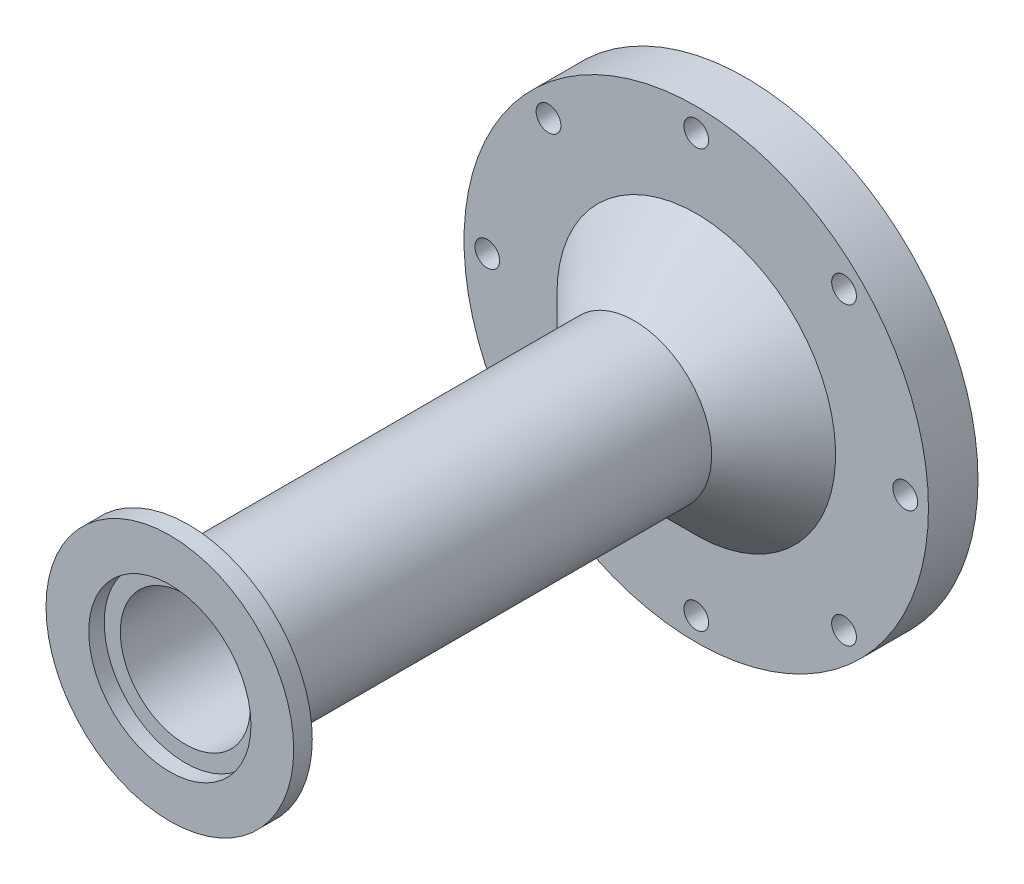
ISO-10303-21;
HEADER;
FILE_DESCRIPTION(('STEP AP214'),'2;1');
FILE_NAME('part.step','',(''),(''),'','','');
FILE_SCHEMA(('AUTOMOTIVE_DESIGN { 1 0 10303 214 1 1 1 1 }'));
ENDSEC;
DATA;
#1=APPLICATION_CONTEXT('core data for automotive mechanical design processes');
#2=APPLICATION_PROTOCOL_DEFINITION('international standard','automotive_design',2000,#1);
#3=PRODUCT_CONTEXT('',#1,'mechanical');
#4=PRODUCT('Part','Part','',(#3));
#5=PRODUCT_RELATED_PRODUCT_CATEGORY('part','',(#4));
#6=PRODUCT_DEFINITION_FORMATION('','',#4);
#7=PRODUCT_DEFINITION_CONTEXT('part definition',#1,'design');
#8=PRODUCT_DEFINITION('design','',#6,#7);
#9=PRODUCT_DEFINITION_SHAPE('','',#8);
#10=(LENGTH_UNIT() NAMED_UNIT(*) SI_UNIT(.MILLI.,.METRE.));
#11=(NAMED_UNIT(*) PLANE_ANGLE_UNIT() SI_UNIT($,.RADIAN.));
#12=(NAMED_UNIT(*) SI_UNIT($,.STERADIAN.) SOLID_ANGLE_UNIT());
#13=UNCERTAINTY_MEASURE_WITH_UNIT(LENGTH_MEASURE(1.E-05),#10,'distance_accuracy_value','');
#14=(GEOMETRIC_REPRESENTATION_CONTEXT(3) GLOBAL_UNCERTAINTY_ASSIGNED_CONTEXT((#13)) GLOBAL_UNIT_ASSIGNED_CONTEXT((#10,
#11,#12)) REPRESENTATION_CONTEXT('',''));
#15=CARTESIAN_POINT('',(0.,0.,0.));
#16=DIRECTION('',(0.,0.,1.));
#17=DIRECTION('',(1.,0.,0.));
#18=AXIS2_PLACEMENT_3D('',#15,#16,#17);
#19=CARTESIAN_POINT('',(0.,0.,88.));
#20=DIRECTION('',(0.,0.,-1.));
#21=DIRECTION('',(-1.,0.,0.));
#22=AXIS2_PLACEMENT_3D('',#19,#20,#21);
#23=CYLINDRICAL_SURFACE('',#22,10.5);
#24=CARTESIAN_POINT('',(0.,0.,0.));
#25=DIRECTION('',(0.,0.,1.));
#26=DIRECTION('',(1.,0.,0.));
#27=AXIS2_PLACEMENT_3D('',#24,#25,#26);
#28=CIRCLE('',#27,10.5);
#29=CARTESIAN_POINT('',(10.5,0.,0.));
#30=VERTEX_POINT('',#29);
#31=EDGE_CURVE('E124',#30,#30,#28,.T.);
#32=ORIENTED_EDGE('',*,*,#31,.F.);
#33=EDGE_LOOP('',(#32));
#34=FACE_BOUND('',#33,.T.);
#35=CARTESIAN_POINT('',(0.,0.,90.51));
#36=DIRECTION('',(0.,0.,1.));
#37=DIRECTION('',(1.,0.,0.));
#38=AXIS2_PLACEMENT_3D('',#35,#36,#37);
#39=CIRCLE('',#38,10.5);
#40=CARTESIAN_POINT('',(10.5,0.,90.51));
#41=VERTEX_POINT('',#40);
#42=EDGE_CURVE('E51',#41,#41,#39,.T.);
#43=ORIENTED_EDGE('',*,*,#42,.T.);
#44=EDGE_LOOP('',(#43));
#45=FACE_BOUND('',#44,.T.);
#46=ADVANCED_FACE('F33',(#34,#45),#23,.F.);
#47=CARTESIAN_POINT('',(0.,0.,8.));
#48=DIRECTION('',(0.,0.,1.));
#49=DIRECTION('',(1.,0.,0.));
#50=AXIS2_PLACEMENT_3D('',#47,#48,#49);
#51=PLANE('',#50);
#52=CARTESIAN_POINT('',(0.,0.,8.));
#53=DIRECTION('',(0.,0.,1.));
#54=DIRECTION('',(1.,0.,0.));
#55=AXIS2_PLACEMENT_3D('',#52,#53,#54);
#56=CIRCLE('',#55,22.4999999999999);
#57=CARTESIAN_POINT('',(-22.4999999999999,0.,8.));
#58=VERTEX_POINT('',#57);
#59=EDGE_CURVE('E10',#58,#58,#56,.F.);
#60=ORIENTED_EDGE('',*,*,#59,.T.);
#61=EDGE_LOOP('',(#60));
#62=FACE_BOUND('',#61,.T.);
#63=CARTESIAN_POINT('',(33.75,0.,8.));
#64=DIRECTION('',(0.,0.,1.));
#65=DIRECTION('',(1.,0.,0.));
#66=AXIS2_PLACEMENT_3D('',#63,#64,#65);
#67=CIRCLE('',#66,2.);
#68=CARTESIAN_POINT('',(35.75,0.,8.));
#69=VERTEX_POINT('',#68);
#70=EDGE_CURVE('E92',#69,#69,#67,.T.);
#71=ORIENTED_EDGE('',*,*,#70,.F.);
#72=EDGE_LOOP('',(#71));
#73=FACE_BOUND('',#72,.T.);
#74=CARTESIAN_POINT('',(-7.23379689482329E-13,-33.7500000000001,8.));
#75=DIRECTION('',(0.,0.,1.));
#76=DIRECTION('',(1.,0.,0.));
#77=AXIS2_PLACEMENT_3D('',#74,#75,#76);
#78=CIRCLE('',#77,2.00000000000001);
#79=CARTESIAN_POINT('',(1.99999999999928,-33.7500000000001,8.));
#80=VERTEX_POINT('',#79);
#81=EDGE_CURVE('E80',#80,#80,#78,.T.);
#82=ORIENTED_EDGE('',*,*,#81,.F.);
#83=EDGE_LOOP('',(#82));
#84=FACE_BOUND('',#83,.T.);
#85=CARTESIAN_POINT('',(-33.7500000000002,1.85615411929518E-13,8.));
#86=DIRECTION('',(0.,0.,1.));
#87=DIRECTION('',(1.,0.,0.));
#88=AXIS2_PLACEMENT_3D('',#85,#86,#87);
#89=CIRCLE('',#88,2.00000000000001);
#90=CARTESIAN_POINT('',(-31.7500000000002,1.85615411929518E-13,8.));
#91=VERTEX_POINT('',#90);
#92=EDGE_CURVE('E68',#91,#91,#89,.T.);
#93=ORIENTED_EDGE('',*,*,#92,.F.);
#94=EDGE_LOOP('',(#93));
#95=FACE_BOUND('',#94,.T.);
#96=CARTESIAN_POINT('',(3.48471251854221E-13,33.75,8.));
#97=DIRECTION('',(0.,0.,1.));
#98=DIRECTION('',(1.,0.,0.));
#99=AXIS2_PLACEMENT_3D('',#96,#97,#98);
#100=CIRCLE('',#99,2.);
#101=CARTESIAN_POINT('',(2.00000000000035,33.75,8.));
#102=VERTEX_POINT('',#101);
#103=EDGE_CURVE('E57',#102,#102,#100,.T.);
#104=ORIENTED_EDGE('',*,*,#103,.F.);
#105=EDGE_LOOP('',(#104));
#106=FACE_BOUND('',#105,.T.);
#107=CARTESIAN_POINT('',(0.,0.,8.));
#108=DIRECTION('',(0.,0.,1.));
#109=DIRECTION('',(1.,0.,0.));
#110=AXIS2_PLACEMENT_3D('',#107,#108,#109);
#111=CIRCLE('',#110,37.5);
#112=CARTESIAN_POINT('',(37.5,0.,8.));
#113=VERTEX_POINT('',#112);
#114=EDGE_CURVE('E44',#113,#113,#111,.T.);
#115=ORIENTED_EDGE('',*,*,#114,.T.);
#116=EDGE_LOOP('',(#115));
#117=FACE_BOUND('',#116,.T.);
#118=CARTESIAN_POINT('',(-23.8648538650459,23.8648538650462,8.));
#119=DIRECTION('',(0.,0.,1.));
#120=DIRECTION('',(1.,0.,0.));
#121=AXIS2_PLACEMENT_3D('',#118,#119,#120);
#122=CIRCLE('',#121,2.00000000000001);
#123=CARTESIAN_POINT('',(-21.8648538650459,23.8648538650462,8.));
#124=VERTEX_POINT('',#123);
#125=EDGE_CURVE('E62',#124,#124,#122,.T.);
#126=ORIENTED_EDGE('',*,*,#125,.F.);
#127=EDGE_LOOP('',(#126));
#128=FACE_BOUND('',#127,.T.);
#129=CARTESIAN_POINT('',(-23.8648538650466,-23.8648538650456,8.));
#130=DIRECTION('',(0.,0.,1.));
#131=DIRECTION('',(1.,0.,0.));
#132=AXIS2_PLACEMENT_3D('',#129,#130,#131);
#133=CIRCLE('',#132,2.00000000000001);
#134=CARTESIAN_POINT('',(-21.8648538650466,-23.8648538650456,8.));
#135=VERTEX_POINT('',#134);
#136=EDGE_CURVE('E74',#135,#135,#133,.T.);
#137=ORIENTED_EDGE('',*,*,#136,.F.);
#138=EDGE_LOOP('',(#137));
#139=FACE_BOUND('',#138,.T.);
#140=CARTESIAN_POINT('',(23.8648538650455,-23.8648538650465,8.));
#141=DIRECTION('',(0.,0.,1.));
#142=DIRECTION('',(1.,0.,0.));
#143=AXIS2_PLACEMENT_3D('',#140,#141,#142);
#144=CIRCLE('',#143,2.);
#145=CARTESIAN_POINT('',(25.8648538650455,-23.8648538650465,8.));
#146=VERTEX_POINT('',#145);
#147=EDGE_CURVE('E86',#146,#146,#144,.T.);
#148=ORIENTED_EDGE('',*,*,#147,.F.);
#149=EDGE_LOOP('',(#148));
#150=FACE_BOUND('',#149,.T.);
#151=CARTESIAN_POINT('',(23.8648538650463,23.8648538650457,8.));
#152=DIRECTION('',(0.,0.,1.));
#153=DIRECTION('',(1.,0.,0.));
#154=AXIS2_PLACEMENT_3D('',#151,#152,#153);
#155=CIRCLE('',#154,2.);
#156=CARTESIAN_POINT('',(25.8648538650463,23.8648538650457,8.));
#157=VERTEX_POINT('',#156);
#158=EDGE_CURVE('E98',#157,#157,#155,.T.);
#159=ORIENTED_EDGE('',*,*,#158,.F.);
#160=EDGE_LOOP('',(#159));
#161=FACE_BOUND('',#160,.T.);
#162=ADVANCED_FACE('F173',(#62,#73,#84,#95,#106,#117,#128,#139,#150,#161),#51,.T.);
#163=CARTESIAN_POINT('',(0.,0.,0.));
#164=DIRECTION('',(0.,0.,1.));
#165=DIRECTION('',(1.,0.,0.));
#166=AXIS2_PLACEMENT_3D('',#163,#164,#165);
#167=PLANE('',#166);
#168=CARTESIAN_POINT('',(33.75,0.,0.));
#169=DIRECTION('',(0.,0.,1.));
#170=DIRECTION('',(1.,0.,0.));
#171=AXIS2_PLACEMENT_3D('',#168,#169,#170);
#172=CIRCLE('',#171,2.);
#173=CARTESIAN_POINT('',(35.75,0.,0.));
#174=VERTEX_POINT('',#173);
#175=EDGE_CURVE('E95',#174,#174,#172,.T.);
#176=ORIENTED_EDGE('',*,*,#175,.T.);
#177=EDGE_LOOP('',(#176));
#178=FACE_BOUND('',#177,.T.);
#179=CARTESIAN_POINT('',(-7.23379689482329E-13,-33.7500000000001,0.));
#180=DIRECTION('',(0.,0.,1.));
#181=DIRECTION('',(1.,0.,0.));
#182=AXIS2_PLACEMENT_3D('',#179,#180,#181);
#183=CIRCLE('',#182,2.00000000000001);
#184=CARTESIAN_POINT('',(1.99999999999928,-33.7500000000001,0.));
#185=VERTEX_POINT('',#184);
#186=EDGE_CURVE('E83',#185,#185,#183,.T.);
#187=ORIENTED_EDGE('',*,*,#186,.T.);
#188=EDGE_LOOP('',(#187));
#189=FACE_BOUND('',#188,.T.);
#190=CARTESIAN_POINT('',(-33.7500000000002,1.85615411929518E-13,0.));
#191=DIRECTION('',(0.,0.,1.));
#192=DIRECTION('',(1.,0.,0.));
#193=AXIS2_PLACEMENT_3D('',#190,#191,#192);
#194=CIRCLE('',#193,2.00000000000001);
#195=CARTESIAN_POINT('',(-31.7500000000002,1.85615411929518E-13,0.));
#196=VERTEX_POINT('',#195);
#197=EDGE_CURVE('E71',#196,#196,#194,.T.);
#198=ORIENTED_EDGE('',*,*,#197,.T.);
#199=EDGE_LOOP('',(#198));
#200=FACE_BOUND('',#199,.T.);
#201=CARTESIAN_POINT('',(3.48471251854221E-13,33.75,0.));
#202=DIRECTION('',(0.,0.,1.));
#203=DIRECTION('',(1.,0.,0.));
#204=AXIS2_PLACEMENT_3D('',#201,#202,#203);
#205=CIRCLE('',#204,2.);
#206=CARTESIAN_POINT('',(2.00000000000035,33.75,0.));
#207=VERTEX_POINT('',#206);
#208=EDGE_CURVE('E59',#207,#207,#205,.T.);
#209=ORIENTED_EDGE('',*,*,#208,.T.);
#210=EDGE_LOOP('',(#209));
#211=FACE_BOUND('',#210,.T.);
#212=CARTESIAN_POINT('',(0.,0.,0.));
#213=DIRECTION('',(0.,0.,1.));
#214=DIRECTION('',(1.,0.,0.));
#215=AXIS2_PLACEMENT_3D('',#212,#213,#214);
#216=CIRCLE('',#215,37.5);
#217=CARTESIAN_POINT('',(37.5,0.,0.));
#218=VERTEX_POINT('',#217);
#219=EDGE_CURVE('E48',#218,#218,#216,.T.);
#220=ORIENTED_EDGE('',*,*,#219,.F.);
#221=EDGE_LOOP('',(#220));
#222=FACE_BOUND('',#221,.T.);
#223=CARTESIAN_POINT('',(-23.8648538650459,23.8648538650462,0.));
#224=DIRECTION('',(0.,0.,1.));
#225=DIRECTION('',(1.,0.,0.));
#226=AXIS2_PLACEMENT_3D('',#223,#224,#225);
#227=CIRCLE('',#226,2.00000000000001);
#228=CARTESIAN_POINT('',(-21.8648538650459,23.8648538650462,0.));
#229=VERTEX_POINT('',#228);
#230=EDGE_CURVE('E65',#229,#229,#227,.T.);
#231=ORIENTED_EDGE('',*,*,#230,.T.);
#232=EDGE_LOOP('',(#231));
#233=FACE_BOUND('',#232,.T.);
#234=CARTESIAN_POINT('',(-23.8648538650466,-23.8648538650456,0.));
#235=DIRECTION('',(0.,0.,1.));
#236=DIRECTION('',(1.,0.,0.));
#237=AXIS2_PLACEMENT_3D('',#234,#235,#236);
#238=CIRCLE('',#237,2.00000000000001);
#239=CARTESIAN_POINT('',(-21.8648538650466,-23.8648538650456,0.));
#240=VERTEX_POINT('',#239);
#241=EDGE_CURVE('E77',#240,#240,#238,.T.);
#242=ORIENTED_EDGE('',*,*,#241,.T.);
#243=EDGE_LOOP('',(#242));
#244=FACE_BOUND('',#243,.T.);
#245=CARTESIAN_POINT('',(23.8648538650455,-23.8648538650465,0.));
#246=DIRECTION('',(0.,0.,1.));
#247=DIRECTION('',(1.,0.,0.));
#248=AXIS2_PLACEMENT_3D('',#245,#246,#247);
#249=CIRCLE('',#248,2.);
#250=CARTESIAN_POINT('',(25.8648538650455,-23.8648538650465,0.));
#251=VERTEX_POINT('',#250);
#252=EDGE_CURVE('E89',#251,#251,#249,.T.);
#253=ORIENTED_EDGE('',*,*,#252,.T.);
#254=EDGE_LOOP('',(#253));
#255=FACE_BOUND('',#254,.T.);
#256=CARTESIAN_POINT('',(23.8648538650463,23.8648538650457,0.));
#257=DIRECTION('',(0.,0.,1.));
#258=DIRECTION('',(1.,0.,0.));
#259=AXIS2_PLACEMENT_3D('',#256,#257,#258);
#260=CIRCLE('',#259,2.);
#261=CARTESIAN_POINT('',(25.8648538650463,23.8648538650457,0.));
#262=VERTEX_POINT('',#261);
#263=EDGE_CURVE('E101',#262,#262,#260,.T.);
#264=ORIENTED_EDGE('',*,*,#263,.T.);
#265=EDGE_LOOP('',(#264));
#266=FACE_BOUND('',#265,.T.);
#267=CARTESIAN_POINT('',(0.,0.,0.));
#268=DIRECTION('',(0.,0.,1.));
#269=DIRECTION('',(1.,0.,0.));
#270=AXIS2_PLACEMENT_3D('',#267,#268,#269);
#271=CIRCLE('',#270,20.71);
#272=CARTESIAN_POINT('',(20.71,0.,0.));
#273=VERTEX_POINT('',#272);
#274=EDGE_CURVE('E107',#273,#273,#271,.T.);
#275=ORIENTED_EDGE('',*,*,#274,.T.);
#276=EDGE_LOOP('',(#275));
#277=FACE_BOUND('',#276,.T.);
#278=ADVANCED_FACE('F178',(#178,#189,#200,#211,#222,#233,#244,#255,#266,#277),#167,.F.);
#279=ORIENTED_EDGE('',*,*,#31,.T.);
#280=EDGE_LOOP('',(#279));
#281=FACE_BOUND('',#280,.T.);
#282=CARTESIAN_POINT('',(0.,0.,0.));
#283=DIRECTION('',(0.,0.,1.));
#284=DIRECTION('',(1.,0.,0.));
#285=AXIS2_PLACEMENT_3D('',#282,#283,#284);
#286=CIRCLE('',#285,19.21);
#287=CARTESIAN_POINT('',(19.21,0.,0.));
#288=VERTEX_POINT('',#287);
#289=EDGE_CURVE('E113',#288,#288,#286,.T.);
#290=ORIENTED_EDGE('',*,*,#289,.F.);
#291=EDGE_LOOP('',(#290));
#292=FACE_BOUND('',#291,.T.);
#293=ADVANCED_FACE('F239',(#281,#292),#167,.F.);
#294=CARTESIAN_POINT('',(0.,0.,8.));
#295=DIRECTION('',(0.,0.,-1.));
#296=DIRECTION('',(-1.,0.,0.));
#297=AXIS2_PLACEMENT_3D('',#294,#295,#296);
#298=CYLINDRICAL_SURFACE('',#297,37.5);
#299=ORIENTED_EDGE('',*,*,#114,.F.);
#300=EDGE_LOOP('',(#299));
#301=FACE_BOUND('',#300,.T.);
#302=ORIENTED_EDGE('',*,*,#219,.T.);
#303=EDGE_LOOP('',(#302));
#304=FACE_BOUND('',#303,.T.);
#305=ADVANCED_FACE('F244',(#301,#304),#298,.T.);
#306=CARTESIAN_POINT('',(3.48471251854221E-13,33.75,8.));
#307=DIRECTION('',(0.,0.,-1.));
#308=DIRECTION('',(-1.,0.,0.));
#309=AXIS2_PLACEMENT_3D('',#306,#307,#308);
#310=CYLINDRICAL_SURFACE('',#309,2.);
#311=ORIENTED_EDGE('',*,*,#103,.T.);
#312=EDGE_LOOP('',(#311));
#313=FACE_BOUND('',#312,.T.);
#314=ORIENTED_EDGE('',*,*,#208,.F.);
#315=EDGE_LOOP('',(#314));
#316=FACE_BOUND('',#315,.T.);
#317=ADVANCED_FACE('F354',(#313,#316),#310,.F.);
#318=CARTESIAN_POINT('',(-23.8648538650459,23.8648538650462,8.));
#319=DIRECTION('',(0.,0.,-1.));
#320=DIRECTION('',(-1.,0.,0.));
#321=AXIS2_PLACEMENT_3D('',#318,#319,#320);
#322=CYLINDRICAL_SURFACE('',#321,2.00000000000001);
#323=ORIENTED_EDGE('',*,*,#125,.T.);
#324=EDGE_LOOP('',(#323));
#325=FACE_BOUND('',#324,.T.);
#326=ORIENTED_EDGE('',*,*,#230,.F.);
#327=EDGE_LOOP('',(#326));
#328=FACE_BOUND('',#327,.T.);
#329=ADVANCED_FACE('F344',(#325,#328),#322,.F.);
#330=CARTESIAN_POINT('',(-33.7500000000002,1.85615411929518E-13,8.));
#331=DIRECTION('',(0.,0.,-1.));
#332=DIRECTION('',(-1.,0.,0.));
#333=AXIS2_PLACEMENT_3D('',#330,#331,#332);
#334=CYLINDRICAL_SURFACE('',#333,2.00000000000001);
#335=ORIENTED_EDGE('',*,*,#92,.T.);
#336=EDGE_LOOP('',(#335));
#337=FACE_BOUND('',#336,.T.);
#338=ORIENTED_EDGE('',*,*,#197,.F.);
#339=EDGE_LOOP('',(#338));
#340=FACE_BOUND('',#339,.T.);
#341=ADVANCED_FACE('F334',(#337,#340),#334,.F.);
#342=CARTESIAN_POINT('',(-23.8648538650466,-23.8648538650456,8.));
#343=DIRECTION('',(0.,0.,-1.));
#344=DIRECTION('',(-1.,0.,0.));
#345=AXIS2_PLACEMENT_3D('',#342,#343,#344);
#346=CYLINDRICAL_SURFACE('',#345,2.00000000000001);
#347=ORIENTED_EDGE('',*,*,#136,.T.);
#348=EDGE_LOOP('',(#347));
#349=FACE_BOUND('',#348,.T.);
#350=ORIENTED_EDGE('',*,*,#241,.F.);
#351=EDGE_LOOP('',(#350));
#352=FACE_BOUND('',#351,.T.);
#353=ADVANCED_FACE('F324',(#349,#352),#346,.F.);
#354=CARTESIAN_POINT('',(-7.23379689482329E-13,-33.7500000000001,8.));
#355=DIRECTION('',(0.,0.,-1.));
#356=DIRECTION('',(-1.,0.,0.));
#357=AXIS2_PLACEMENT_3D('',#354,#355,#356);
#358=CYLINDRICAL_SURFACE('',#357,2.00000000000001);
#359=ORIENTED_EDGE('',*,*,#81,.T.);
#360=EDGE_LOOP('',(#359));
#361=FACE_BOUND('',#360,.T.);
#362=ORIENTED_EDGE('',*,*,#186,.F.);
#363=EDGE_LOOP('',(#362));
#364=FACE_BOUND('',#363,.T.);
#365=ADVANCED_FACE('F314',(#361,#364),#358,.F.);
#366=CARTESIAN_POINT('',(23.8648538650455,-23.8648538650465,8.));
#367=DIRECTION('',(0.,0.,-1.));
#368=DIRECTION('',(-1.,0.,0.));
#369=AXIS2_PLACEMENT_3D('',#366,#367,#368);
#370=CYLINDRICAL_SURFACE('',#369,2.);
#371=ORIENTED_EDGE('',*,*,#147,.T.);
#372=EDGE_LOOP('',(#371));
#373=FACE_BOUND('',#372,.T.);
#374=ORIENTED_EDGE('',*,*,#252,.F.);
#375=EDGE_LOOP('',(#374));
#376=FACE_BOUND('',#375,.T.);
#377=ADVANCED_FACE('F304',(#373,#376),#370,.F.);
#378=CARTESIAN_POINT('',(33.75,0.,8.));
#379=DIRECTION('',(0.,0.,-1.));
#380=DIRECTION('',(-1.,0.,0.));
#381=AXIS2_PLACEMENT_3D('',#378,#379,#380);
#382=CYLINDRICAL_SURFACE('',#381,2.);
#383=ORIENTED_EDGE('',*,*,#70,.T.);
#384=EDGE_LOOP('',(#383));
#385=FACE_BOUND('',#384,.T.);
#386=ORIENTED_EDGE('',*,*,#175,.F.);
#387=EDGE_LOOP('',(#386));
#388=FACE_BOUND('',#387,.T.);
#389=ADVANCED_FACE('F294',(#385,#388),#382,.F.);
#390=CARTESIAN_POINT('',(23.8648538650463,23.8648538650457,8.));
#391=DIRECTION('',(0.,0.,-1.));
#392=DIRECTION('',(-1.,0.,0.));
#393=AXIS2_PLACEMENT_3D('',#390,#391,#392);
#394=CYLINDRICAL_SURFACE('',#393,2.);
#395=ORIENTED_EDGE('',*,*,#158,.T.);
#396=EDGE_LOOP('',(#395));
#397=FACE_BOUND('',#396,.T.);
#398=ORIENTED_EDGE('',*,*,#263,.F.);
#399=EDGE_LOOP('',(#398));
#400=FACE_BOUND('',#399,.T.);
#401=ADVANCED_FACE('F277',(#397,#400),#394,.F.);
#402=CARTESIAN_POINT('',(0.,0.,2.));
#403=DIRECTION('',(0.,0.,1.));
#404=DIRECTION('',(1.,0.,0.));
#405=AXIS2_PLACEMENT_3D('',#402,#403,#404);
#406=PLANE('',#405);
#407=CARTESIAN_POINT('',(0.,0.,2.));
#408=DIRECTION('',(0.,0.,1.));
#409=DIRECTION('',(1.,0.,0.));
#410=AXIS2_PLACEMENT_3D('',#407,#408,#409);
#411=CIRCLE('',#410,20.71);
#412=CARTESIAN_POINT('',(20.71,0.,2.));
#413=VERTEX_POINT('',#412);
#414=EDGE_CURVE('E104',#413,#413,#411,.T.);
#415=ORIENTED_EDGE('',*,*,#414,.F.);
#416=EDGE_LOOP('',(#415));
#417=FACE_BOUND('',#416,.T.);
#418=CARTESIAN_POINT('',(0.,0.,2.));
#419=DIRECTION('',(0.,0.,1.));
#420=DIRECTION('',(1.,0.,0.));
#421=AXIS2_PLACEMENT_3D('',#418,#419,#420);
#422=CIRCLE('',#421,19.21);
#423=CARTESIAN_POINT('',(19.21,0.,2.));
#424=VERTEX_POINT('',#423);
#425=EDGE_CURVE('E110',#424,#424,#422,.T.);
#426=ORIENTED_EDGE('',*,*,#425,.T.);
#427=EDGE_LOOP('',(#426));
#428=FACE_BOUND('',#427,.T.);
#429=ADVANCED_FACE('F267',(#417,#428),#406,.F.);
#430=CARTESIAN_POINT('',(0.,0.,2.));
#431=DIRECTION('',(0.,0.,-1.));
#432=DIRECTION('',(-1.,0.,0.));
#433=AXIS2_PLACEMENT_3D('',#430,#431,#432);
#434=CYLINDRICAL_SURFACE('',#433,20.71);
#435=ORIENTED_EDGE('',*,*,#414,.T.);
#436=EDGE_LOOP('',(#435));
#437=FACE_BOUND('',#436,.T.);
#438=ORIENTED_EDGE('',*,*,#274,.F.);
#439=EDGE_LOOP('',(#438));
#440=FACE_BOUND('',#439,.T.);
#441=ADVANCED_FACE('F168',(#437,#440),#434,.F.);
#442=CARTESIAN_POINT('',(0.,0.,2.));
#443=DIRECTION('',(0.,0.,-1.));
#444=DIRECTION('',(-1.,0.,0.));
#445=AXIS2_PLACEMENT_3D('',#442,#443,#444);
#446=CYLINDRICAL_SURFACE('',#445,19.21);
#447=ORIENTED_EDGE('',*,*,#425,.F.);
#448=EDGE_LOOP('',(#447));
#449=FACE_BOUND('',#448,.T.);
#450=ORIENTED_EDGE('',*,*,#289,.T.);
#451=EDGE_LOOP('',(#450));
#452=FACE_BOUND('',#451,.T.);
#453=ADVANCED_FACE('F163',(#449,#452),#446,.T.);
#454=CARTESIAN_POINT('',(0.,0.,88.));
#455=DIRECTION('',(0.,0.,-1.));
#456=DIRECTION('',(-1.,0.,0.));
#457=AXIS2_PLACEMENT_3D('',#454,#455,#456);
#458=CYLINDRICAL_SURFACE('',#457,12.5);
#459=CARTESIAN_POINT('',(0.,0.,18.0000000000001));
#460=DIRECTION('',(0.,0.,1.));
#461=DIRECTION('',(1.,0.,0.));
#462=AXIS2_PLACEMENT_3D('',#459,#460,#461);
#463=CIRCLE('',#462,12.5);
#464=CARTESIAN_POINT('',(-12.5,0.,18.0000000000001));
#465=VERTEX_POINT('',#464);
#466=EDGE_CURVE('E40',#465,#465,#463,.T.);
#467=ORIENTED_EDGE('',*,*,#466,.T.);
#468=EDGE_LOOP('',(#467));
#469=FACE_BOUND('',#468,.T.);
#470=CARTESIAN_POINT('',(0.,0.,88.));
#471=DIRECTION('',(0.,0.,1.));
#472=DIRECTION('',(1.,0.,0.));
#473=AXIS2_PLACEMENT_3D('',#470,#471,#472);
#474=CIRCLE('',#473,12.5);
#475=CARTESIAN_POINT('',(12.5,0.,88.));
#476=VERTEX_POINT('',#475);
#477=EDGE_CURVE('E116',#476,#476,#474,.T.);
#478=ORIENTED_EDGE('',*,*,#477,.F.);
#479=EDGE_LOOP('',(#478));
#480=FACE_BOUND('',#479,.T.);
#481=ADVANCED_FACE('F158',(#469,#480),#458,.T.);
#482=CARTESIAN_POINT('',(0.,0.,88.));
#483=DIRECTION('',(0.,0.,1.));
#484=DIRECTION('',(1.,0.,0.));
#485=AXIS2_PLACEMENT_3D('',#482,#483,#484);
#486=CONICAL_SURFACE('',#485,12.5,1.30899693899575);
#487=CARTESIAN_POINT('',(0.,0.,90.01));
#488=DIRECTION('',(0.,0.,1.));
#489=DIRECTION('',(1.,0.,0.));
#490=AXIS2_PLACEMENT_3D('',#487,#488,#489);
#491=CIRCLE('',#490,20.0014221232135);
#492=CARTESIAN_POINT('',(20.0014221232135,0.,90.01));
#493=VERTEX_POINT('',#492);
#494=EDGE_CURVE('E121',#493,#493,#491,.T.);
#495=ORIENTED_EDGE('',*,*,#494,.F.);
#496=EDGE_LOOP('',(#495));
#497=FACE_BOUND('',#496,.T.);
#498=ORIENTED_EDGE('',*,*,#477,.T.);
#499=EDGE_LOOP('',(#498));
#500=FACE_BOUND('',#499,.T.);
#501=ADVANCED_FACE('F147',(#497,#500),#486,.T.);
#502=CARTESIAN_POINT('',(0.,0.,93.01));
#503=DIRECTION('',(0.,0.,1.));
#504=DIRECTION('',(1.,0.,0.));
#505=AXIS2_PLACEMENT_3D('',#502,#503,#504);
#506=PLANE('',#505);
#507=CARTESIAN_POINT('',(0.,0.,93.01));
#508=DIRECTION('',(0.,0.,1.));
#509=DIRECTION('',(1.,0.,0.));
#510=AXIS2_PLACEMENT_3D('',#507,#508,#509);
#511=CIRCLE('',#510,13.1);
#512=CARTESIAN_POINT('',(13.1,0.,93.01));
#513=VERTEX_POINT('',#512);
#514=EDGE_CURVE('E129',#513,#513,#511,.T.);
#515=ORIENTED_EDGE('',*,*,#514,.F.);
#516=EDGE_LOOP('',(#515));
#517=FACE_BOUND('',#516,.T.);
#518=CARTESIAN_POINT('',(0.,0.,93.01));
#519=DIRECTION('',(0.,0.,1.));
#520=DIRECTION('',(1.,0.,0.));
#521=AXIS2_PLACEMENT_3D('',#518,#519,#520);
#522=CIRCLE('',#521,20.0014221232135);
#523=CARTESIAN_POINT('',(20.0014221232135,0.,93.01));
#524=VERTEX_POINT('',#523);
#525=EDGE_CURVE('E54',#524,#524,#522,.T.);
#526=ORIENTED_EDGE('',*,*,#525,.T.);
#527=EDGE_LOOP('',(#526));
#528=FACE_BOUND('',#527,.T.);
#529=ADVANCED_FACE('F144',(#517,#528),#506,.T.);
#530=CARTESIAN_POINT('',(0.,0.,93.01));
#531=DIRECTION('',(0.,0.,-1.));
#532=DIRECTION('',(-1.,0.,0.));
#533=AXIS2_PLACEMENT_3D('',#530,#531,#532);
#534=CYLINDRICAL_SURFACE('',#533,20.0014221232135);
#535=ORIENTED_EDGE('',*,*,#525,.F.);
#536=EDGE_LOOP('',(#535));
#537=FACE_BOUND('',#536,.T.);
#538=ORIENTED_EDGE('',*,*,#494,.T.);
#539=EDGE_LOOP('',(#538));
#540=FACE_BOUND('',#539,.T.);
#541=ADVANCED_FACE('F140',(#537,#540),#534,.T.);
#542=CARTESIAN_POINT('',(0.,0.,90.51));
#543=DIRECTION('',(0.,0.,1.));
#544=DIRECTION('',(1.,0.,0.));
#545=AXIS2_PLACEMENT_3D('',#542,#543,#544);
#546=CYLINDRICAL_SURFACE('',#545,13.1);
#547=CARTESIAN_POINT('',(0.,0.,90.51));
#548=DIRECTION('',(0.,0.,1.));
#549=DIRECTION('',(1.,0.,0.));
#550=AXIS2_PLACEMENT_3D('',#547,#548,#549);
#551=CIRCLE('',#550,13.1);
#552=CARTESIAN_POINT('',(13.1,0.,90.51));
#553=VERTEX_POINT('',#552);
#554=EDGE_CURVE('E55',#553,#553,#551,.T.);
#555=ORIENTED_EDGE('',*,*,#554,.F.);
#556=EDGE_LOOP('',(#555));
#557=FACE_BOUND('',#556,.T.);
#558=ORIENTED_EDGE('',*,*,#514,.T.);
#559=EDGE_LOOP('',(#558));
#560=FACE_BOUND('',#559,.T.);
#561=ADVANCED_FACE('F137',(#557,#560),#546,.F.);
#562=CARTESIAN_POINT('',(0.,0.,90.51));
#563=DIRECTION('',(0.,0.,1.));
#564=DIRECTION('',(1.,0.,0.));
#565=AXIS2_PLACEMENT_3D('',#562,#563,#564);
#566=PLANE('',#565);
#567=ORIENTED_EDGE('',*,*,#42,.F.);
#568=EDGE_LOOP('',(#567));
#569=FACE_BOUND('',#568,.T.);
#570=ORIENTED_EDGE('',*,*,#554,.T.);
#571=EDGE_LOOP('',(#570));
#572=FACE_BOUND('',#571,.T.);
#573=ADVANCED_FACE('F135',(#569,#572),#566,.T.);
#574=CARTESIAN_POINT('',(0.,0.,18.0000000000001));
#575=DIRECTION('',(0.,0.,-1.));
#576=DIRECTION('',(-1.,0.,0.));
#577=AXIS2_PLACEMENT_3D('',#574,#575,#576);
#578=CONICAL_SURFACE('',#577,12.5,0.785398163397443);
#579=CARTESIAN_POINT('',(-22.4999999999999,0.,8.));
#580=CARTESIAN_POINT('',(-22.3958333333333,0.,8.10416666666667));
#581=CARTESIAN_POINT('',(-22.2916666666666,0.,8.20833333333333));
#582=CARTESIAN_POINT('',(-22.0833333333333,0.,8.41666666666667));
#583=CARTESIAN_POINT('',(-21.9791666666666,0.,8.52083333333334));
#584=CARTESIAN_POINT('',(-21.7708333333333,0.,8.72916666666667));
#585=CARTESIAN_POINT('',(-21.6666666666666,0.,8.83333333333334));
#586=CARTESIAN_POINT('',(-21.4583333333333,0.,9.04166666666667));
#587=CARTESIAN_POINT('',(-21.3541666666666,0.,9.14583333333334));
#588=CARTESIAN_POINT('',(-21.1458333333333,0.,9.35416666666667));
#589=CARTESIAN_POINT('',(-21.0416666666666,0.,9.45833333333334));
#590=CARTESIAN_POINT('',(-20.8333333333333,0.,9.66666666666667));
#591=CARTESIAN_POINT('',(-20.7291666666666,0.,9.77083333333334));
#592=CARTESIAN_POINT('',(-20.5208333333333,0.,9.97916666666668));
#593=CARTESIAN_POINT('',(-20.4166666666666,0.,10.0833333333333));
#594=CARTESIAN_POINT('',(-20.2083333333333,0.,10.2916666666667));
#595=CARTESIAN_POINT('',(-20.1041666666666,0.,10.3958333333333));
#596=CARTESIAN_POINT('',(-19.8958333333333,0.,10.6041666666667));
#597=CARTESIAN_POINT('',(-19.7916666666666,0.,10.7083333333333));
#598=CARTESIAN_POINT('',(-19.5833333333333,0.,10.9166666666667));
#599=CARTESIAN_POINT('',(-19.4791666666666,0.,11.0208333333333));
#600=CARTESIAN_POINT('',(-19.2708333333333,0.,11.2291666666667));
#601=CARTESIAN_POINT('',(-19.1666666666666,0.,11.3333333333333));
#602=CARTESIAN_POINT('',(-18.9583333333333,0.,11.5416666666667));
#603=CARTESIAN_POINT('',(-18.8541666666666,0.,11.6458333333334));
#604=CARTESIAN_POINT('',(-18.6458333333333,0.,11.8541666666667));
#605=CARTESIAN_POINT('',(-18.5416666666666,0.,11.9583333333334));
#606=CARTESIAN_POINT('',(-18.3333333333333,0.,12.1666666666667));
#607=CARTESIAN_POINT('',(-18.2291666666666,0.,12.2708333333334));
#608=CARTESIAN_POINT('',(-18.0208333333333,0.,12.4791666666667));
#609=CARTESIAN_POINT('',(-17.9166666666666,0.,12.5833333333334));
#610=CARTESIAN_POINT('',(-17.7083333333333,0.,12.7916666666667));
#611=CARTESIAN_POINT('',(-17.6041666666666,0.,12.8958333333334));
#612=CARTESIAN_POINT('',(-17.3958333333333,0.,13.1041666666667));
#613=CARTESIAN_POINT('',(-17.2916666666666,0.,13.2083333333334));
#614=CARTESIAN_POINT('',(-17.0833333333333,0.,13.4166666666667));
#615=CARTESIAN_POINT('',(-16.9791666666666,0.,13.5208333333334));
#616=CARTESIAN_POINT('',(-16.7708333333333,0.,13.7291666666667));
#617=CARTESIAN_POINT('',(-16.6666666666666,0.,13.8333333333334));
#618=CARTESIAN_POINT('',(-16.4583333333333,0.,14.0416666666667));
#619=CARTESIAN_POINT('',(-16.3541666666667,0.,14.1458333333334));
#620=CARTESIAN_POINT('',(-16.1458333333333,0.,14.3541666666667));
#621=CARTESIAN_POINT('',(-16.0416666666667,0.,14.4583333333334));
#622=CARTESIAN_POINT('',(-15.8333333333333,0.,14.6666666666667));
#623=CARTESIAN_POINT('',(-15.7291666666667,0.,14.7708333333334));
#624=CARTESIAN_POINT('',(-15.5208333333333,0.,14.9791666666667));
#625=CARTESIAN_POINT('',(-15.4166666666667,0.,15.0833333333334));
#626=CARTESIAN_POINT('',(-15.2083333333333,0.,15.2916666666667));
#627=CARTESIAN_POINT('',(-15.1041666666667,0.,15.3958333333334));
#628=CARTESIAN_POINT('',(-14.8958333333333,0.,15.6041666666667));
#629=CARTESIAN_POINT('',(-14.7916666666667,0.,15.7083333333334));
#630=CARTESIAN_POINT('',(-14.5833333333333,0.,15.9166666666667));
#631=CARTESIAN_POINT('',(-14.4791666666667,0.,16.0208333333334));
#632=CARTESIAN_POINT('',(-14.2708333333333,0.,16.2291666666667));
#633=CARTESIAN_POINT('',(-14.1666666666667,0.,16.3333333333334));
#634=CARTESIAN_POINT('',(-13.9583333333333,0.,16.5416666666667));
#635=CARTESIAN_POINT('',(-13.8541666666667,0.,16.6458333333334));
#636=CARTESIAN_POINT('',(-13.6458333333333,0.,16.8541666666667));
#637=CARTESIAN_POINT('',(-13.5416666666667,0.,16.9583333333334));
#638=CARTESIAN_POINT('',(-13.3333333333333,0.,17.1666666666667));
#639=CARTESIAN_POINT('',(-13.2291666666667,0.,17.2708333333334));
#640=CARTESIAN_POINT('',(-13.0208333333333,0.,17.4791666666667));
#641=CARTESIAN_POINT('',(-12.9166666666667,0.,17.5833333333334));
#642=CARTESIAN_POINT('',(-12.7083333333333,0.,17.7916666666667));
#643=CARTESIAN_POINT('',(-12.6041666666667,0.,17.8958333333334));
#644=CARTESIAN_POINT('',(-12.5,0.,18.0000000000001));
#645=B_SPLINE_CURVE_WITH_KNOTS('',3,(#579,#580,#581,#582,#583,#584,#585,#586,#587,#588,#589,
#590,#591,#592,#593,#594,#595,#596,#597,#598,#599,#600,#601,#602,#603,#604,#605,#606,#607,#608,
#609,#610,#611,#612,#613,#614,#615,#616,#617,#618,#619,#620,#621,#622,#623,#624,#625,#626,#627,
#628,#629,#630,#631,#632,#633,#634,#635,#636,#637,#638,#639,#640,#641,#642,#643,#644),
.UNSPECIFIED.,.F.,.F.,(4,2,2,2,2,2,2,2,2,2,2,2,2,2,2,2,2,2,2,2,2,2,2,2,2,2,2,2,2,2,2,2,4),(0.,
0.441941738241591,0.883883476483185,1.32582521472478,1.76776695296637,2.20970869120796,
2.65165042944956,3.09359216769115,3.53553390593274,3.97747564417433,4.41941738241592,
4.86135912065751,5.30330085889911,5.7452425971407,6.18718433538229,6.62912607362388,
7.07106781186548,7.51300955010707,7.95495128834866,8.39689302659025,8.83883476483184,
9.28077650307344,9.72271824131503,10.1646599795566,10.6066017177982,11.0485434560398,
11.4904851942814,11.932426932523,12.3743686707646,12.8163104090062,13.2582521472478,
13.7001938854894,14.142135623731),.UNSPECIFIED.);
#646=EDGE_CURVE('BSEAM35',#58,#465,#645,.T.);
#647=ORIENTED_EDGE('',*,*,#59,.F.);
#648=ORIENTED_EDGE('',*,*,#466,.F.);
#649=ORIENTED_EDGE('',*,*,#646,.T.);
#650=ORIENTED_EDGE('',*,*,#646,.F.);
#651=EDGE_LOOP('',(#647,#649,#648,#650));
#652=FACE_BOUND('',#651,.T.);
#653=ADVANCED_FACE('F35',(#652),#578,.T.);
#654=CLOSED_SHELL('',(#46,#162,#278,#293,#305,#317,#329,#341,#353,#365,#377,#389,#401,#429,#441,
#453,#481,#501,#529,#541,#561,#573,#653));
#655=MANIFOLD_SOLID_BREP('B2',#654);
#656=ADVANCED_BREP_SHAPE_REPRESENTATION('',(#18,#655),#14);
#657=SHAPE_DEFINITION_REPRESENTATION(#9,#656);
ENDSEC;
END-ISO-10303-21;
